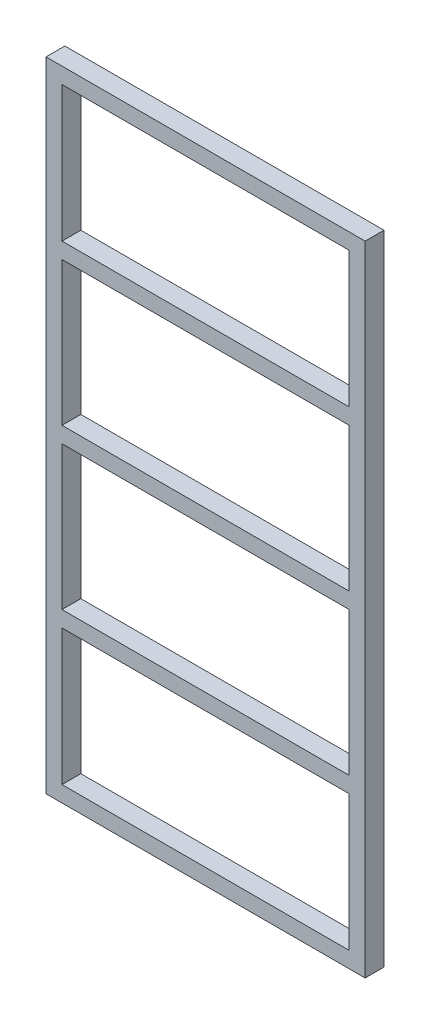
ISO-10303-21;
HEADER;
FILE_DESCRIPTION(('STEP AP214'),'2;1');
FILE_NAME('part.step','',(''),(''),'','','');
FILE_SCHEMA(('AUTOMOTIVE_DESIGN { 1 0 10303 214 1 1 1 1 }'));
ENDSEC;
DATA;
#1=APPLICATION_CONTEXT('core data for automotive mechanical design processes');
#2=APPLICATION_PROTOCOL_DEFINITION('international standard','automotive_design',2000,#1);
#3=PRODUCT_CONTEXT('',#1,'mechanical');
#4=PRODUCT('Part','Part','',(#3));
#5=PRODUCT_RELATED_PRODUCT_CATEGORY('part','',(#4));
#6=PRODUCT_DEFINITION_FORMATION('','',#4);
#7=PRODUCT_DEFINITION_CONTEXT('part definition',#1,'design');
#8=PRODUCT_DEFINITION('design','',#6,#7);
#9=PRODUCT_DEFINITION_SHAPE('','',#8);
#10=(LENGTH_UNIT() NAMED_UNIT(*) SI_UNIT(.MILLI.,.METRE.));
#11=(NAMED_UNIT(*) PLANE_ANGLE_UNIT() SI_UNIT($,.RADIAN.));
#12=(NAMED_UNIT(*) SI_UNIT($,.STERADIAN.) SOLID_ANGLE_UNIT());
#13=UNCERTAINTY_MEASURE_WITH_UNIT(LENGTH_MEASURE(1.E-05),#10,'distance_accuracy_value','');
#14=(GEOMETRIC_REPRESENTATION_CONTEXT(3) GLOBAL_UNCERTAINTY_ASSIGNED_CONTEXT((#13)) GLOBAL_UNIT_ASSIGNED_CONTEXT((#10,
#11,#12)) REPRESENTATION_CONTEXT('',''));
#15=CARTESIAN_POINT('',(0.,0.,0.));
#16=DIRECTION('',(0.,0.,1.));
#17=DIRECTION('',(1.,0.,0.));
#18=AXIS2_PLACEMENT_3D('',#15,#16,#17);
#19=CARTESIAN_POINT('',(0.,0.,3.));
#20=DIRECTION('',(0.,0.,1.));
#21=DIRECTION('',(1.,0.,0.));
#22=AXIS2_PLACEMENT_3D('',#19,#20,#21);
#23=PLANE('',#22);
#24=DIRECTION('',(0.,1.,0.));
#25=VECTOR('',#24,1.);
#26=CARTESIAN_POINT('',(25.4,50.8,3.));
#27=LINE('',#26,#25);
#28=CARTESIAN_POINT('',(25.4,-50.8,3.));
#29=VERTEX_POINT('',#28);
#30=CARTESIAN_POINT('',(25.4,50.8,3.));
#31=VERTEX_POINT('',#30);
#32=EDGE_CURVE('E356',#29,#31,#27,.T.);
#33=ORIENTED_EDGE('',*,*,#32,.T.);
#34=DIRECTION('',(-1.,0.,0.));
#35=VECTOR('',#34,1.);
#36=CARTESIAN_POINT('',(-25.4,50.8,3.));
#37=LINE('',#36,#35);
#38=CARTESIAN_POINT('',(-25.4,50.8,3.));
#39=VERTEX_POINT('',#38);
#40=EDGE_CURVE('E360',#31,#39,#37,.T.);
#41=ORIENTED_EDGE('',*,*,#40,.T.);
#42=DIRECTION('',(0.,-1.,0.));
#43=VECTOR('',#42,1.);
#44=CARTESIAN_POINT('',(-25.4,50.8,3.));
#45=LINE('',#44,#43);
#46=CARTESIAN_POINT('',(-25.4,-50.8,3.));
#47=VERTEX_POINT('',#46);
#48=EDGE_CURVE('E364',#39,#47,#45,.T.);
#49=ORIENTED_EDGE('',*,*,#48,.T.);
#50=DIRECTION('',(1.,0.,0.));
#51=VECTOR('',#50,1.);
#52=CARTESIAN_POINT('',(-25.4,-50.8,3.));
#53=LINE('',#52,#51);
#54=EDGE_CURVE('E367',#47,#29,#53,.T.);
#55=ORIENTED_EDGE('',*,*,#54,.T.);
#56=EDGE_LOOP('',(#33,#41,#49,#55));
#57=FACE_BOUND('',#56,.T.);
#58=DIRECTION('',(1.,0.,0.));
#59=VECTOR('',#58,1.);
#60=CARTESIAN_POINT('',(22.86,26.67,3.));
#61=LINE('',#60,#59);
#62=CARTESIAN_POINT('',(-22.86,26.67,3.));
#63=VERTEX_POINT('',#62);
#64=CARTESIAN_POINT('',(22.86,26.67,3.));
#65=VERTEX_POINT('',#64);
#66=EDGE_CURVE('E316',#63,#65,#61,.T.);
#67=ORIENTED_EDGE('',*,*,#66,.F.);
#68=DIRECTION('',(0.,-1.,0.));
#69=VECTOR('',#68,1.);
#70=CARTESIAN_POINT('',(-22.86,48.26,3.));
#71=LINE('',#70,#69);
#72=CARTESIAN_POINT('',(-22.86,48.26,3.));
#73=VERTEX_POINT('',#72);
#74=EDGE_CURVE('E313',#73,#63,#71,.T.);
#75=ORIENTED_EDGE('',*,*,#74,.F.);
#76=DIRECTION('',(-1.,0.,0.));
#77=VECTOR('',#76,1.);
#78=CARTESIAN_POINT('',(-22.86,48.26,3.));
#79=LINE('',#78,#77);
#80=CARTESIAN_POINT('',(22.86,48.26,3.));
#81=VERTEX_POINT('',#80);
#82=EDGE_CURVE('E324',#81,#73,#79,.T.);
#83=ORIENTED_EDGE('',*,*,#82,.F.);
#84=DIRECTION('',(0.,1.,0.));
#85=VECTOR('',#84,1.);
#86=CARTESIAN_POINT('',(22.86,48.26,3.));
#87=LINE('',#86,#85);
#88=EDGE_CURVE('E320',#65,#81,#87,.T.);
#89=ORIENTED_EDGE('',*,*,#88,.F.);
#90=EDGE_LOOP('',(#67,#75,#83,#89));
#91=FACE_BOUND('',#90,.T.);
#92=DIRECTION('',(-1.,0.,0.));
#93=VECTOR('',#92,1.);
#94=CARTESIAN_POINT('',(22.86,-26.67,3.));
#95=LINE('',#94,#93);
#96=CARTESIAN_POINT('',(22.86,-26.67,3.));
#97=VERTEX_POINT('',#96);
#98=CARTESIAN_POINT('',(-22.86,-26.67,3.));
#99=VERTEX_POINT('',#98);
#100=EDGE_CURVE('E273',#97,#99,#95,.T.);
#101=ORIENTED_EDGE('',*,*,#100,.F.);
#102=DIRECTION('',(0.,1.,0.));
#103=VECTOR('',#102,1.);
#104=CARTESIAN_POINT('',(22.86,-26.67,3.));
#105=LINE('',#104,#103);
#106=CARTESIAN_POINT('',(22.86,-48.26,3.));
#107=VERTEX_POINT('',#106);
#108=EDGE_CURVE('E270',#107,#97,#105,.T.);
#109=ORIENTED_EDGE('',*,*,#108,.F.);
#110=DIRECTION('',(1.,0.,0.));
#111=VECTOR('',#110,1.);
#112=CARTESIAN_POINT('',(-22.86,-48.26,3.));
#113=LINE('',#112,#111);
#114=CARTESIAN_POINT('',(-22.86,-48.26,3.));
#115=VERTEX_POINT('',#114);
#116=EDGE_CURVE('E281',#115,#107,#113,.T.);
#117=ORIENTED_EDGE('',*,*,#116,.F.);
#118=DIRECTION('',(0.,-1.,0.));
#119=VECTOR('',#118,1.);
#120=CARTESIAN_POINT('',(-22.86,-26.67,3.));
#121=LINE('',#120,#119);
#122=EDGE_CURVE('E277',#99,#115,#121,.T.);
#123=ORIENTED_EDGE('',*,*,#122,.F.);
#124=EDGE_LOOP('',(#101,#109,#117,#123));
#125=FACE_BOUND('',#124,.T.);
#126=DIRECTION('',(-1.,0.,0.));
#127=VECTOR('',#126,1.);
#128=CARTESIAN_POINT('',(22.86,24.13,3.));
#129=LINE('',#128,#127);
#130=CARTESIAN_POINT('',(22.86,24.13,3.));
#131=VERTEX_POINT('',#130);
#132=CARTESIAN_POINT('',(-22.86,24.13,3.));
#133=VERTEX_POINT('',#132);
#134=EDGE_CURVE('E230',#131,#133,#129,.T.);
#135=ORIENTED_EDGE('',*,*,#134,.F.);
#136=DIRECTION('',(0.,1.,0.));
#137=VECTOR('',#136,1.);
#138=CARTESIAN_POINT('',(22.86,24.13,3.));
#139=LINE('',#138,#137);
#140=CARTESIAN_POINT('',(22.86,1.27000000000001,3.));
#141=VERTEX_POINT('',#140);
#142=EDGE_CURVE('E227',#141,#131,#139,.T.);
#143=ORIENTED_EDGE('',*,*,#142,.F.);
#144=DIRECTION('',(1.,0.,0.));
#145=VECTOR('',#144,1.);
#146=CARTESIAN_POINT('',(22.86,1.27000000000001,3.));
#147=LINE('',#146,#145);
#148=CARTESIAN_POINT('',(-22.86,1.27000000000001,3.));
#149=VERTEX_POINT('',#148);
#150=EDGE_CURVE('E238',#149,#141,#147,.T.);
#151=ORIENTED_EDGE('',*,*,#150,.F.);
#152=DIRECTION('',(0.,-1.,0.));
#153=VECTOR('',#152,1.);
#154=CARTESIAN_POINT('',(-22.86,24.13,3.));
#155=LINE('',#154,#153);
#156=EDGE_CURVE('E234',#133,#149,#155,.T.);
#157=ORIENTED_EDGE('',*,*,#156,.F.);
#158=EDGE_LOOP('',(#135,#143,#151,#157));
#159=FACE_BOUND('',#158,.T.);
#160=DIRECTION('',(-1.,0.,0.));
#161=VECTOR('',#160,1.);
#162=CARTESIAN_POINT('',(22.86,-1.26999999999999,3.));
#163=LINE('',#162,#161);
#164=CARTESIAN_POINT('',(22.86,-1.26999999999999,3.));
#165=VERTEX_POINT('',#164);
#166=CARTESIAN_POINT('',(-22.86,-1.26999999999999,3.));
#167=VERTEX_POINT('',#166);
#168=EDGE_CURVE('E188',#165,#167,#163,.T.);
#169=ORIENTED_EDGE('',*,*,#168,.F.);
#170=DIRECTION('',(0.,1.,0.));
#171=VECTOR('',#170,1.);
#172=CARTESIAN_POINT('',(22.86,-1.26999999999999,3.));
#173=LINE('',#172,#171);
#174=CARTESIAN_POINT('',(22.86,-24.13,3.));
#175=VERTEX_POINT('',#174);
#176=EDGE_CURVE('E179',#175,#165,#173,.T.);
#177=ORIENTED_EDGE('',*,*,#176,.F.);
#178=DIRECTION('',(1.,0.,0.));
#179=VECTOR('',#178,1.);
#180=CARTESIAN_POINT('',(22.86,-24.13,3.));
#181=LINE('',#180,#179);
#182=CARTESIAN_POINT('',(-22.86,-24.13,3.));
#183=VERTEX_POINT('',#182);
#184=EDGE_CURVE('E205',#183,#175,#181,.T.);
#185=ORIENTED_EDGE('',*,*,#184,.F.);
#186=DIRECTION('',(0.,-1.,0.));
#187=VECTOR('',#186,1.);
#188=CARTESIAN_POINT('',(-22.86,-1.26999999999999,3.));
#189=LINE('',#188,#187);
#190=EDGE_CURVE('E201',#167,#183,#189,.T.);
#191=ORIENTED_EDGE('',*,*,#190,.F.);
#192=EDGE_LOOP('',(#169,#177,#185,#191));
#193=FACE_BOUND('',#192,.T.);
#194=ADVANCED_FACE('F41',(#57,#91,#125,#159,#193),#23,.T.);
#195=CARTESIAN_POINT('',(0.,0.,0.));
#196=DIRECTION('',(0.,0.,1.));
#197=DIRECTION('',(1.,0.,0.));
#198=AXIS2_PLACEMENT_3D('',#195,#196,#197);
#199=PLANE('',#198);
#200=DIRECTION('',(0.,1.,0.));
#201=VECTOR('',#200,1.);
#202=CARTESIAN_POINT('',(22.86,24.13,0.));
#203=LINE('',#202,#201);
#204=CARTESIAN_POINT('',(22.86,1.27000000000001,0.));
#205=VERTEX_POINT('',#204);
#206=CARTESIAN_POINT('',(22.86,24.13,0.));
#207=VERTEX_POINT('',#206);
#208=EDGE_CURVE('E197',#205,#207,#203,.T.);
#209=ORIENTED_EDGE('',*,*,#208,.T.);
#210=DIRECTION('',(-1.,0.,0.));
#211=VECTOR('',#210,1.);
#212=CARTESIAN_POINT('',(22.86,24.13,0.));
#213=LINE('',#212,#211);
#214=CARTESIAN_POINT('',(-22.86,24.13,0.));
#215=VERTEX_POINT('',#214);
#216=EDGE_CURVE('E245',#207,#215,#213,.T.);
#217=ORIENTED_EDGE('',*,*,#216,.T.);
#218=DIRECTION('',(0.,-1.,0.));
#219=VECTOR('',#218,1.);
#220=CARTESIAN_POINT('',(-22.86,24.13,0.));
#221=LINE('',#220,#219);
#222=CARTESIAN_POINT('',(-22.86,1.27000000000001,0.));
#223=VERTEX_POINT('',#222);
#224=EDGE_CURVE('E249',#215,#223,#221,.T.);
#225=ORIENTED_EDGE('',*,*,#224,.T.);
#226=DIRECTION('',(1.,0.,0.));
#227=VECTOR('',#226,1.);
#228=CARTESIAN_POINT('',(22.86,1.27000000000001,0.));
#229=LINE('',#228,#227);
#230=EDGE_CURVE('E231',#223,#205,#229,.T.);
#231=ORIENTED_EDGE('',*,*,#230,.T.);
#232=EDGE_LOOP('',(#209,#217,#225,#231));
#233=FACE_BOUND('',#232,.T.);
#234=DIRECTION('',(0.,-1.,0.));
#235=VECTOR('',#234,1.);
#236=CARTESIAN_POINT('',(-22.86,48.26,0.));
#237=LINE('',#236,#235);
#238=CARTESIAN_POINT('',(-22.86,48.26,0.));
#239=VERTEX_POINT('',#238);
#240=CARTESIAN_POINT('',(-22.86,26.67,0.));
#241=VERTEX_POINT('',#240);
#242=EDGE_CURVE('E312',#239,#241,#237,.T.);
#243=ORIENTED_EDGE('',*,*,#242,.T.);
#244=DIRECTION('',(1.,0.,0.));
#245=VECTOR('',#244,1.);
#246=CARTESIAN_POINT('',(22.86,26.67,0.));
#247=LINE('',#246,#245);
#248=CARTESIAN_POINT('',(22.86,26.67,0.));
#249=VERTEX_POINT('',#248);
#250=EDGE_CURVE('E331',#241,#249,#247,.T.);
#251=ORIENTED_EDGE('',*,*,#250,.T.);
#252=DIRECTION('',(0.,1.,0.));
#253=VECTOR('',#252,1.);
#254=CARTESIAN_POINT('',(22.86,48.26,0.));
#255=LINE('',#254,#253);
#256=CARTESIAN_POINT('',(22.86,48.26,0.));
#257=VERTEX_POINT('',#256);
#258=EDGE_CURVE('E335',#249,#257,#255,.T.);
#259=ORIENTED_EDGE('',*,*,#258,.T.);
#260=DIRECTION('',(-1.,0.,0.));
#261=VECTOR('',#260,1.);
#262=CARTESIAN_POINT('',(-22.86,48.26,0.));
#263=LINE('',#262,#261);
#264=EDGE_CURVE('E317',#257,#239,#263,.T.);
#265=ORIENTED_EDGE('',*,*,#264,.T.);
#266=EDGE_LOOP('',(#243,#251,#259,#265));
#267=FACE_BOUND('',#266,.T.);
#268=DIRECTION('',(0.,1.,0.));
#269=VECTOR('',#268,1.);
#270=CARTESIAN_POINT('',(25.4,50.8,0.));
#271=LINE('',#270,#269);
#272=CARTESIAN_POINT('',(25.4,-50.8,0.));
#273=VERTEX_POINT('',#272);
#274=CARTESIAN_POINT('',(25.4,50.8,0.));
#275=VERTEX_POINT('',#274);
#276=EDGE_CURVE('E355',#273,#275,#271,.T.);
#277=ORIENTED_EDGE('',*,*,#276,.F.);
#278=DIRECTION('',(1.,0.,0.));
#279=VECTOR('',#278,1.);
#280=CARTESIAN_POINT('',(-25.4,-50.8,0.));
#281=LINE('',#280,#279);
#282=CARTESIAN_POINT('',(-25.4,-50.8,0.));
#283=VERTEX_POINT('',#282);
#284=EDGE_CURVE('E361',#283,#273,#281,.T.);
#285=ORIENTED_EDGE('',*,*,#284,.F.);
#286=DIRECTION('',(0.,-1.,0.));
#287=VECTOR('',#286,1.);
#288=CARTESIAN_POINT('',(-25.4,50.8,0.));
#289=LINE('',#288,#287);
#290=CARTESIAN_POINT('',(-25.4,50.8,0.));
#291=VERTEX_POINT('',#290);
#292=EDGE_CURVE('E377',#291,#283,#289,.T.);
#293=ORIENTED_EDGE('',*,*,#292,.F.);
#294=DIRECTION('',(-1.,0.,0.));
#295=VECTOR('',#294,1.);
#296=CARTESIAN_POINT('',(-25.4,50.8,0.));
#297=LINE('',#296,#295);
#298=EDGE_CURVE('E374',#275,#291,#297,.T.);
#299=ORIENTED_EDGE('',*,*,#298,.F.);
#300=EDGE_LOOP('',(#277,#285,#293,#299));
#301=FACE_BOUND('',#300,.T.);
#302=DIRECTION('',(0.,1.,0.));
#303=VECTOR('',#302,1.);
#304=CARTESIAN_POINT('',(22.86,-26.67,0.));
#305=LINE('',#304,#303);
#306=CARTESIAN_POINT('',(22.86,-48.26,0.));
#307=VERTEX_POINT('',#306);
#308=CARTESIAN_POINT('',(22.86,-26.67,0.));
#309=VERTEX_POINT('',#308);
#310=EDGE_CURVE('E269',#307,#309,#305,.T.);
#311=ORIENTED_EDGE('',*,*,#310,.T.);
#312=DIRECTION('',(-1.,0.,0.));
#313=VECTOR('',#312,1.);
#314=CARTESIAN_POINT('',(22.86,-26.67,0.));
#315=LINE('',#314,#313);
#316=CARTESIAN_POINT('',(-22.86,-26.67,0.));
#317=VERTEX_POINT('',#316);
#318=EDGE_CURVE('E288',#309,#317,#315,.T.);
#319=ORIENTED_EDGE('',*,*,#318,.T.);
#320=DIRECTION('',(0.,-1.,0.));
#321=VECTOR('',#320,1.);
#322=CARTESIAN_POINT('',(-22.86,-26.67,0.));
#323=LINE('',#322,#321);
#324=CARTESIAN_POINT('',(-22.86,-48.26,0.));
#325=VERTEX_POINT('',#324);
#326=EDGE_CURVE('E292',#317,#325,#323,.T.);
#327=ORIENTED_EDGE('',*,*,#326,.T.);
#328=DIRECTION('',(1.,0.,0.));
#329=VECTOR('',#328,1.);
#330=CARTESIAN_POINT('',(-22.86,-48.26,0.));
#331=LINE('',#330,#329);
#332=EDGE_CURVE('E274',#325,#307,#331,.T.);
#333=ORIENTED_EDGE('',*,*,#332,.T.);
#334=EDGE_LOOP('',(#311,#319,#327,#333));
#335=FACE_BOUND('',#334,.T.);
#336=DIRECTION('',(0.,1.,0.));
#337=VECTOR('',#336,1.);
#338=CARTESIAN_POINT('',(22.86,-1.26999999999999,0.));
#339=LINE('',#338,#337);
#340=CARTESIAN_POINT('',(22.86,-24.13,0.));
#341=VERTEX_POINT('',#340);
#342=CARTESIAN_POINT('',(22.86,-1.26999999999999,0.));
#343=VERTEX_POINT('',#342);
#344=EDGE_CURVE('E65',#341,#343,#339,.T.);
#345=ORIENTED_EDGE('',*,*,#344,.T.);
#346=DIRECTION('',(-1.,0.,0.));
#347=VECTOR('',#346,1.);
#348=CARTESIAN_POINT('',(22.86,-1.26999999999999,0.));
#349=LINE('',#348,#347);
#350=CARTESIAN_POINT('',(-22.86,-1.26999999999999,0.));
#351=VERTEX_POINT('',#350);
#352=EDGE_CURVE('E195',#343,#351,#349,.T.);
#353=ORIENTED_EDGE('',*,*,#352,.T.);
#354=DIRECTION('',(0.,-1.,0.));
#355=VECTOR('',#354,1.);
#356=CARTESIAN_POINT('',(-22.86,-1.26999999999999,0.));
#357=LINE('',#356,#355);
#358=CARTESIAN_POINT('',(-22.86,-24.13,0.));
#359=VERTEX_POINT('',#358);
#360=EDGE_CURVE('E214',#351,#359,#357,.T.);
#361=ORIENTED_EDGE('',*,*,#360,.T.);
#362=DIRECTION('',(1.,0.,0.));
#363=VECTOR('',#362,1.);
#364=CARTESIAN_POINT('',(22.86,-24.13,0.));
#365=LINE('',#364,#363);
#366=EDGE_CURVE('E189',#359,#341,#365,.T.);
#367=ORIENTED_EDGE('',*,*,#366,.T.);
#368=EDGE_LOOP('',(#345,#353,#361,#367));
#369=FACE_BOUND('',#368,.T.);
#370=ADVANCED_FACE('F400',(#233,#267,#301,#335,#369),#199,.F.);
#371=CARTESIAN_POINT('',(25.4,50.8,3.));
#372=DIRECTION('',(-1.,0.,0.));
#373=DIRECTION('',(0.,-1.,0.));
#374=AXIS2_PLACEMENT_3D('',#371,#372,#373);
#375=PLANE('',#374);
#376=ORIENTED_EDGE('',*,*,#276,.T.);
#377=DIRECTION('',(0.,0.,-1.));
#378=VECTOR('',#377,1.);
#379=CARTESIAN_POINT('',(25.4,50.8,3.));
#380=LINE('',#379,#378);
#381=EDGE_CURVE('E11',#31,#275,#380,.T.);
#382=ORIENTED_EDGE('',*,*,#381,.F.);
#383=ORIENTED_EDGE('',*,*,#32,.F.);
#384=DIRECTION('',(0.,0.,-1.));
#385=VECTOR('',#384,1.);
#386=CARTESIAN_POINT('',(25.4,-50.8,3.));
#387=LINE('',#386,#385);
#388=EDGE_CURVE('E370',#29,#273,#387,.T.);
#389=ORIENTED_EDGE('',*,*,#388,.T.);
#390=EDGE_LOOP('',(#376,#382,#383,#389));
#391=FACE_BOUND('',#390,.T.);
#392=ADVANCED_FACE('F43',(#391),#375,.F.);
#393=CARTESIAN_POINT('',(-25.4,50.8,3.));
#394=DIRECTION('',(0.,-1.,0.));
#395=DIRECTION('',(0.,0.,-1.));
#396=AXIS2_PLACEMENT_3D('',#393,#394,#395);
#397=PLANE('',#396);
#398=ORIENTED_EDGE('',*,*,#298,.T.);
#399=DIRECTION('',(0.,0.,-1.));
#400=VECTOR('',#399,1.);
#401=CARTESIAN_POINT('',(-25.4,50.8,3.));
#402=LINE('',#401,#400);
#403=EDGE_CURVE('E50',#39,#291,#402,.T.);
#404=ORIENTED_EDGE('',*,*,#403,.F.);
#405=ORIENTED_EDGE('',*,*,#40,.F.);
#406=ORIENTED_EDGE('',*,*,#381,.T.);
#407=EDGE_LOOP('',(#398,#404,#405,#406));
#408=FACE_BOUND('',#407,.T.);
#409=ADVANCED_FACE('F411',(#408),#397,.F.);
#410=CARTESIAN_POINT('',(-25.4,50.8,3.));
#411=DIRECTION('',(1.,0.,0.));
#412=DIRECTION('',(0.,1.,0.));
#413=AXIS2_PLACEMENT_3D('',#410,#411,#412);
#414=PLANE('',#413);
#415=ORIENTED_EDGE('',*,*,#292,.T.);
#416=DIRECTION('',(0.,0.,-1.));
#417=VECTOR('',#416,1.);
#418=CARTESIAN_POINT('',(-25.4,-50.8,3.));
#419=LINE('',#418,#417);
#420=EDGE_CURVE('E385',#47,#283,#419,.T.);
#421=ORIENTED_EDGE('',*,*,#420,.F.);
#422=ORIENTED_EDGE('',*,*,#48,.F.);
#423=ORIENTED_EDGE('',*,*,#403,.T.);
#424=EDGE_LOOP('',(#415,#421,#422,#423));
#425=FACE_BOUND('',#424,.T.);
#426=ADVANCED_FACE('F394',(#425),#414,.F.);
#427=CARTESIAN_POINT('',(-25.4,-50.8,3.));
#428=DIRECTION('',(0.,1.,0.));
#429=DIRECTION('',(0.,0.,1.));
#430=AXIS2_PLACEMENT_3D('',#427,#428,#429);
#431=PLANE('',#430);
#432=ORIENTED_EDGE('',*,*,#284,.T.);
#433=ORIENTED_EDGE('',*,*,#388,.F.);
#434=ORIENTED_EDGE('',*,*,#54,.F.);
#435=ORIENTED_EDGE('',*,*,#420,.T.);
#436=EDGE_LOOP('',(#432,#433,#434,#435));
#437=FACE_BOUND('',#436,.T.);
#438=ADVANCED_FACE('F404',(#437),#431,.F.);
#439=CARTESIAN_POINT('',(-22.86,48.26,3.));
#440=DIRECTION('',(1.,0.,0.));
#441=DIRECTION('',(0.,1.,0.));
#442=AXIS2_PLACEMENT_3D('',#439,#440,#441);
#443=PLANE('',#442);
#444=ORIENTED_EDGE('',*,*,#242,.F.);
#445=DIRECTION('',(0.,0.,-1.));
#446=VECTOR('',#445,1.);
#447=CARTESIAN_POINT('',(-22.86,48.26,3.));
#448=LINE('',#447,#446);
#449=EDGE_CURVE('E327',#73,#239,#448,.T.);
#450=ORIENTED_EDGE('',*,*,#449,.F.);
#451=ORIENTED_EDGE('',*,*,#74,.T.);
#452=DIRECTION('',(0.,0.,-1.));
#453=VECTOR('',#452,1.);
#454=CARTESIAN_POINT('',(-22.86,26.67,3.));
#455=LINE('',#454,#453);
#456=EDGE_CURVE('E351',#63,#241,#455,.T.);
#457=ORIENTED_EDGE('',*,*,#456,.T.);
#458=EDGE_LOOP('',(#444,#450,#451,#457));
#459=FACE_BOUND('',#458,.T.);
#460=ADVANCED_FACE('F426',(#459),#443,.T.);
#461=CARTESIAN_POINT('',(22.86,26.67,3.));
#462=DIRECTION('',(0.,1.,0.));
#463=DIRECTION('',(-1.,0.,0.));
#464=AXIS2_PLACEMENT_3D('',#461,#462,#463);
#465=PLANE('',#464);
#466=ORIENTED_EDGE('',*,*,#250,.F.);
#467=ORIENTED_EDGE('',*,*,#456,.F.);
#468=ORIENTED_EDGE('',*,*,#66,.T.);
#469=DIRECTION('',(0.,0.,-1.));
#470=VECTOR('',#469,1.);
#471=CARTESIAN_POINT('',(22.86,26.67,3.));
#472=LINE('',#471,#470);
#473=EDGE_CURVE('E348',#65,#249,#472,.T.);
#474=ORIENTED_EDGE('',*,*,#473,.T.);
#475=EDGE_LOOP('',(#466,#467,#468,#474));
#476=FACE_BOUND('',#475,.T.);
#477=ADVANCED_FACE('F433',(#476),#465,.T.);
#478=CARTESIAN_POINT('',(22.86,48.26,3.));
#479=DIRECTION('',(-1.,0.,0.));
#480=DIRECTION('',(0.,0.,1.));
#481=AXIS2_PLACEMENT_3D('',#478,#479,#480);
#482=PLANE('',#481);
#483=ORIENTED_EDGE('',*,*,#258,.F.);
#484=ORIENTED_EDGE('',*,*,#473,.F.);
#485=ORIENTED_EDGE('',*,*,#88,.T.);
#486=DIRECTION('',(0.,0.,-1.));
#487=VECTOR('',#486,1.);
#488=CARTESIAN_POINT('',(22.86,48.26,3.));
#489=LINE('',#488,#487);
#490=EDGE_CURVE('E345',#81,#257,#489,.T.);
#491=ORIENTED_EDGE('',*,*,#490,.T.);
#492=EDGE_LOOP('',(#483,#484,#485,#491));
#493=FACE_BOUND('',#492,.T.);
#494=ADVANCED_FACE('F438',(#493),#482,.T.);
#495=CARTESIAN_POINT('',(-22.86,48.26,3.));
#496=DIRECTION('',(0.,-1.,0.));
#497=DIRECTION('',(0.,0.,-1.));
#498=AXIS2_PLACEMENT_3D('',#495,#496,#497);
#499=PLANE('',#498);
#500=ORIENTED_EDGE('',*,*,#264,.F.);
#501=ORIENTED_EDGE('',*,*,#490,.F.);
#502=ORIENTED_EDGE('',*,*,#82,.T.);
#503=ORIENTED_EDGE('',*,*,#449,.T.);
#504=EDGE_LOOP('',(#500,#501,#502,#503));
#505=FACE_BOUND('',#504,.T.);
#506=ADVANCED_FACE('F446',(#505),#499,.T.);
#507=CARTESIAN_POINT('',(22.86,-26.67,3.));
#508=DIRECTION('',(-1.,0.,0.));
#509=DIRECTION('',(0.,-1.,0.));
#510=AXIS2_PLACEMENT_3D('',#507,#508,#509);
#511=PLANE('',#510);
#512=ORIENTED_EDGE('',*,*,#310,.F.);
#513=DIRECTION('',(0.,0.,-1.));
#514=VECTOR('',#513,1.);
#515=CARTESIAN_POINT('',(22.86,-48.26,3.));
#516=LINE('',#515,#514);
#517=EDGE_CURVE('E284',#107,#307,#516,.T.);
#518=ORIENTED_EDGE('',*,*,#517,.F.);
#519=ORIENTED_EDGE('',*,*,#108,.T.);
#520=DIRECTION('',(0.,0.,-1.));
#521=VECTOR('',#520,1.);
#522=CARTESIAN_POINT('',(22.86,-26.67,3.));
#523=LINE('',#522,#521);
#524=EDGE_CURVE('E308',#97,#309,#523,.T.);
#525=ORIENTED_EDGE('',*,*,#524,.T.);
#526=EDGE_LOOP('',(#512,#518,#519,#525));
#527=FACE_BOUND('',#526,.T.);
#528=ADVANCED_FACE('F500',(#527),#511,.T.);
#529=CARTESIAN_POINT('',(22.86,-26.67,3.));
#530=DIRECTION('',(0.,-1.,0.));
#531=DIRECTION('',(1.,0.,0.));
#532=AXIS2_PLACEMENT_3D('',#529,#530,#531);
#533=PLANE('',#532);
#534=ORIENTED_EDGE('',*,*,#318,.F.);
#535=ORIENTED_EDGE('',*,*,#524,.F.);
#536=ORIENTED_EDGE('',*,*,#100,.T.);
#537=DIRECTION('',(0.,0.,-1.));
#538=VECTOR('',#537,1.);
#539=CARTESIAN_POINT('',(-22.86,-26.67,3.));
#540=LINE('',#539,#538);
#541=EDGE_CURVE('E305',#99,#317,#540,.T.);
#542=ORIENTED_EDGE('',*,*,#541,.T.);
#543=EDGE_LOOP('',(#534,#535,#536,#542));
#544=FACE_BOUND('',#543,.T.);
#545=ADVANCED_FACE('F496',(#544),#533,.T.);
#546=CARTESIAN_POINT('',(-22.86,-26.67,3.));
#547=DIRECTION('',(1.,0.,0.));
#548=DIRECTION('',(0.,1.,0.));
#549=AXIS2_PLACEMENT_3D('',#546,#547,#548);
#550=PLANE('',#549);
#551=ORIENTED_EDGE('',*,*,#326,.F.);
#552=ORIENTED_EDGE('',*,*,#541,.F.);
#553=ORIENTED_EDGE('',*,*,#122,.T.);
#554=DIRECTION('',(0.,0.,-1.));
#555=VECTOR('',#554,1.);
#556=CARTESIAN_POINT('',(-22.86,-48.26,3.));
#557=LINE('',#556,#555);
#558=EDGE_CURVE('E302',#115,#325,#557,.T.);
#559=ORIENTED_EDGE('',*,*,#558,.T.);
#560=EDGE_LOOP('',(#551,#552,#553,#559));
#561=FACE_BOUND('',#560,.T.);
#562=ADVANCED_FACE('F492',(#561),#550,.T.);
#563=CARTESIAN_POINT('',(-22.86,-48.26,3.));
#564=DIRECTION('',(0.,1.,0.));
#565=DIRECTION('',(0.,0.,1.));
#566=AXIS2_PLACEMENT_3D('',#563,#564,#565);
#567=PLANE('',#566);
#568=ORIENTED_EDGE('',*,*,#332,.F.);
#569=ORIENTED_EDGE('',*,*,#558,.F.);
#570=ORIENTED_EDGE('',*,*,#116,.T.);
#571=ORIENTED_EDGE('',*,*,#517,.T.);
#572=EDGE_LOOP('',(#568,#569,#570,#571));
#573=FACE_BOUND('',#572,.T.);
#574=ADVANCED_FACE('F489',(#573),#567,.T.);
#575=CARTESIAN_POINT('',(22.86,24.13,3.));
#576=DIRECTION('',(-1.,0.,0.));
#577=DIRECTION('',(0.,-1.,0.));
#578=AXIS2_PLACEMENT_3D('',#575,#576,#577);
#579=PLANE('',#578);
#580=ORIENTED_EDGE('',*,*,#208,.F.);
#581=DIRECTION('',(0.,0.,-1.));
#582=VECTOR('',#581,1.);
#583=CARTESIAN_POINT('',(22.86,1.27000000000001,3.));
#584=LINE('',#583,#582);
#585=EDGE_CURVE('E241',#141,#205,#584,.T.);
#586=ORIENTED_EDGE('',*,*,#585,.F.);
#587=ORIENTED_EDGE('',*,*,#142,.T.);
#588=DIRECTION('',(0.,0.,-1.));
#589=VECTOR('',#588,1.);
#590=CARTESIAN_POINT('',(22.86,24.13,3.));
#591=LINE('',#590,#589);
#592=EDGE_CURVE('E265',#131,#207,#591,.T.);
#593=ORIENTED_EDGE('',*,*,#592,.T.);
#594=EDGE_LOOP('',(#580,#586,#587,#593));
#595=FACE_BOUND('',#594,.T.);
#596=ADVANCED_FACE('F471',(#595),#579,.T.);
#597=CARTESIAN_POINT('',(22.86,24.13,3.));
#598=DIRECTION('',(0.,-1.,0.));
#599=DIRECTION('',(1.,0.,0.));
#600=AXIS2_PLACEMENT_3D('',#597,#598,#599);
#601=PLANE('',#600);
#602=ORIENTED_EDGE('',*,*,#216,.F.);
#603=ORIENTED_EDGE('',*,*,#592,.F.);
#604=ORIENTED_EDGE('',*,*,#134,.T.);
#605=DIRECTION('',(0.,0.,-1.));
#606=VECTOR('',#605,1.);
#607=CARTESIAN_POINT('',(-22.86,24.13,3.));
#608=LINE('',#607,#606);
#609=EDGE_CURVE('E262',#133,#215,#608,.T.);
#610=ORIENTED_EDGE('',*,*,#609,.T.);
#611=EDGE_LOOP('',(#602,#603,#604,#610));
#612=FACE_BOUND('',#611,.T.);
#613=ADVANCED_FACE('F465',(#612),#601,.T.);
#614=CARTESIAN_POINT('',(-22.86,24.13,3.));
#615=DIRECTION('',(1.,0.,0.));
#616=DIRECTION('',(0.,0.,-1.));
#617=AXIS2_PLACEMENT_3D('',#614,#615,#616);
#618=PLANE('',#617);
#619=ORIENTED_EDGE('',*,*,#224,.F.);
#620=ORIENTED_EDGE('',*,*,#609,.F.);
#621=ORIENTED_EDGE('',*,*,#156,.T.);
#622=DIRECTION('',(0.,0.,-1.));
#623=VECTOR('',#622,1.);
#624=CARTESIAN_POINT('',(-22.86,1.27000000000001,3.));
#625=LINE('',#624,#623);
#626=EDGE_CURVE('E259',#149,#223,#625,.T.);
#627=ORIENTED_EDGE('',*,*,#626,.T.);
#628=EDGE_LOOP('',(#619,#620,#621,#627));
#629=FACE_BOUND('',#628,.T.);
#630=ADVANCED_FACE('F468',(#629),#618,.T.);
#631=CARTESIAN_POINT('',(22.86,1.27000000000001,3.));
#632=DIRECTION('',(0.,1.,0.));
#633=DIRECTION('',(0.,0.,1.));
#634=AXIS2_PLACEMENT_3D('',#631,#632,#633);
#635=PLANE('',#634);
#636=ORIENTED_EDGE('',*,*,#230,.F.);
#637=ORIENTED_EDGE('',*,*,#626,.F.);
#638=ORIENTED_EDGE('',*,*,#150,.T.);
#639=ORIENTED_EDGE('',*,*,#585,.T.);
#640=EDGE_LOOP('',(#636,#637,#638,#639));
#641=FACE_BOUND('',#640,.T.);
#642=ADVANCED_FACE('F474',(#641),#635,.T.);
#643=CARTESIAN_POINT('',(22.86,-1.26999999999999,3.));
#644=DIRECTION('',(-1.,0.,0.));
#645=DIRECTION('',(0.,0.,1.));
#646=AXIS2_PLACEMENT_3D('',#643,#644,#645);
#647=PLANE('',#646);
#648=ORIENTED_EDGE('',*,*,#344,.F.);
#649=DIRECTION('',(0.,0.,-1.));
#650=VECTOR('',#649,1.);
#651=CARTESIAN_POINT('',(22.86,-24.13,3.));
#652=LINE('',#651,#650);
#653=EDGE_CURVE('E183',#175,#341,#652,.T.);
#654=ORIENTED_EDGE('',*,*,#653,.F.);
#655=ORIENTED_EDGE('',*,*,#176,.T.);
#656=DIRECTION('',(0.,0.,-1.));
#657=VECTOR('',#656,1.);
#658=CARTESIAN_POINT('',(22.86,-1.26999999999999,3.));
#659=LINE('',#658,#657);
#660=EDGE_CURVE('E182',#165,#343,#659,.T.);
#661=ORIENTED_EDGE('',*,*,#660,.T.);
#662=EDGE_LOOP('',(#648,#654,#655,#661));
#663=FACE_BOUND('',#662,.T.);
#664=ADVANCED_FACE('F181',(#663),#647,.T.);
#665=CARTESIAN_POINT('',(22.86,-1.26999999999999,3.));
#666=DIRECTION('',(0.,-1.,0.));
#667=DIRECTION('',(0.,0.,-1.));
#668=AXIS2_PLACEMENT_3D('',#665,#666,#667);
#669=PLANE('',#668);
#670=ORIENTED_EDGE('',*,*,#352,.F.);
#671=ORIENTED_EDGE('',*,*,#660,.F.);
#672=ORIENTED_EDGE('',*,*,#168,.T.);
#673=DIRECTION('',(0.,0.,-1.));
#674=VECTOR('',#673,1.);
#675=CARTESIAN_POINT('',(-22.86,-1.26999999999999,3.));
#676=LINE('',#675,#674);
#677=EDGE_CURVE('E198',#167,#351,#676,.T.);
#678=ORIENTED_EDGE('',*,*,#677,.T.);
#679=EDGE_LOOP('',(#670,#671,#672,#678));
#680=FACE_BOUND('',#679,.T.);
#681=ADVANCED_FACE('F192',(#680),#669,.T.);
#682=CARTESIAN_POINT('',(-22.86,-1.26999999999999,3.));
#683=DIRECTION('',(1.,0.,0.));
#684=DIRECTION('',(0.,0.,-1.));
#685=AXIS2_PLACEMENT_3D('',#682,#683,#684);
#686=PLANE('',#685);
#687=ORIENTED_EDGE('',*,*,#360,.F.);
#688=ORIENTED_EDGE('',*,*,#677,.F.);
#689=ORIENTED_EDGE('',*,*,#190,.T.);
#690=DIRECTION('',(0.,0.,-1.));
#691=VECTOR('',#690,1.);
#692=CARTESIAN_POINT('',(-22.86,-24.13,3.));
#693=LINE('',#692,#691);
#694=EDGE_CURVE('E57',#183,#359,#693,.T.);
#695=ORIENTED_EDGE('',*,*,#694,.T.);
#696=EDGE_LOOP('',(#687,#688,#689,#695));
#697=FACE_BOUND('',#696,.T.);
#698=ADVANCED_FACE('F551',(#697),#686,.T.);
#699=CARTESIAN_POINT('',(22.86,-24.13,3.));
#700=DIRECTION('',(0.,1.,0.));
#701=DIRECTION('',(-1.,0.,0.));
#702=AXIS2_PLACEMENT_3D('',#699,#700,#701);
#703=PLANE('',#702);
#704=ORIENTED_EDGE('',*,*,#366,.F.);
#705=ORIENTED_EDGE('',*,*,#694,.F.);
#706=ORIENTED_EDGE('',*,*,#184,.T.);
#707=ORIENTED_EDGE('',*,*,#653,.T.);
#708=EDGE_LOOP('',(#704,#705,#706,#707));
#709=FACE_BOUND('',#708,.T.);
#710=ADVANCED_FACE('F558',(#709),#703,.T.);
#711=CLOSED_SHELL('',(#194,#370,#392,#409,#426,#438,#460,#477,#494,#506,#528,#545,#562,#574,
#596,#613,#630,#642,#664,#681,#698,#710));
#712=MANIFOLD_SOLID_BREP('B2',#711);
#713=ADVANCED_BREP_SHAPE_REPRESENTATION('',(#18,#712),#14);
#714=SHAPE_DEFINITION_REPRESENTATION(#9,#713);
ENDSEC;
END-ISO-10303-21;
